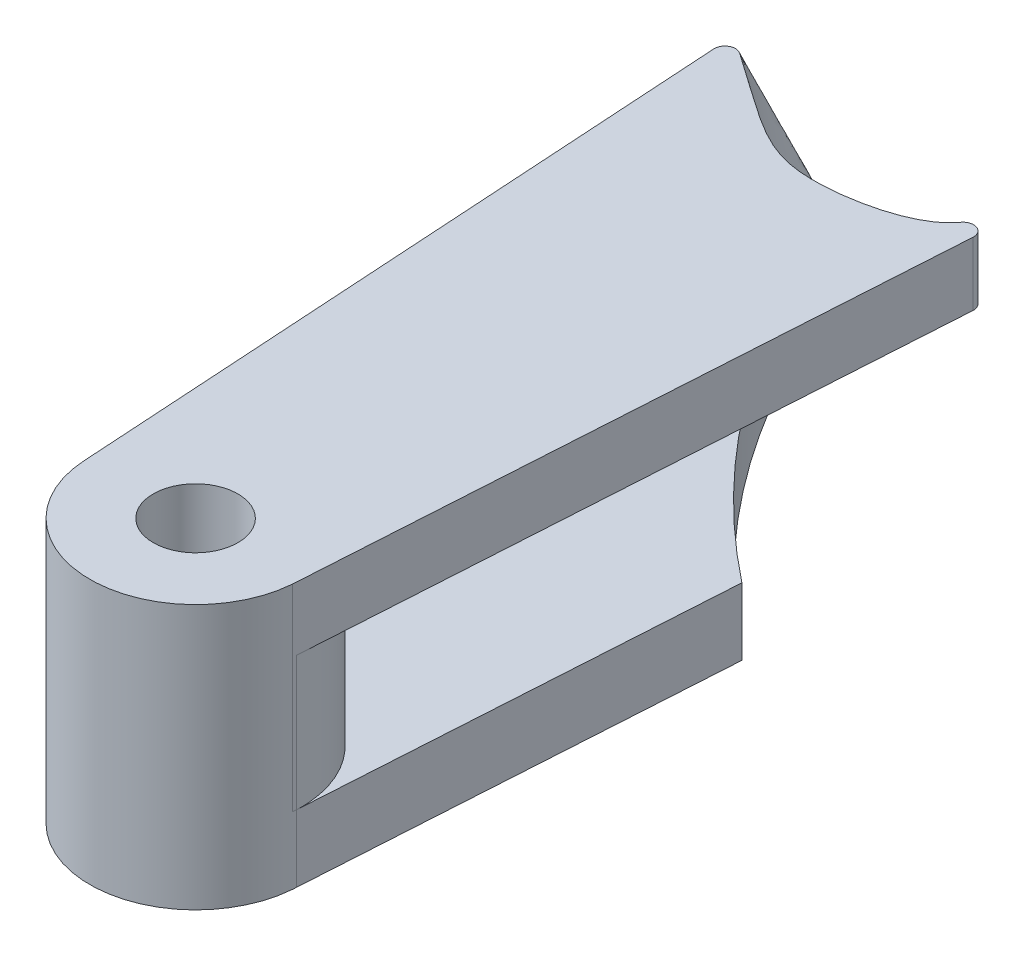
ISO-10303-21;
HEADER;
FILE_DESCRIPTION(('STEP AP214'),'2;1');
FILE_NAME('part.step','',(''),(''),'','','');
FILE_SCHEMA(('AUTOMOTIVE_DESIGN { 1 0 10303 214 1 1 1 1 }'));
ENDSEC;
DATA;
#1=APPLICATION_CONTEXT('core data for automotive mechanical design processes');
#2=APPLICATION_PROTOCOL_DEFINITION('international standard','automotive_design',2000,#1);
#3=PRODUCT_CONTEXT('',#1,'mechanical');
#4=PRODUCT('Part','Part','',(#3));
#5=PRODUCT_RELATED_PRODUCT_CATEGORY('part','',(#4));
#6=PRODUCT_DEFINITION_FORMATION('','',#4);
#7=PRODUCT_DEFINITION_CONTEXT('part definition',#1,'design');
#8=PRODUCT_DEFINITION('design','',#6,#7);
#9=PRODUCT_DEFINITION_SHAPE('','',#8);
#10=(LENGTH_UNIT() NAMED_UNIT(*) SI_UNIT(.MILLI.,.METRE.));
#11=(NAMED_UNIT(*) PLANE_ANGLE_UNIT() SI_UNIT($,.RADIAN.));
#12=(NAMED_UNIT(*) SI_UNIT($,.STERADIAN.) SOLID_ANGLE_UNIT());
#13=UNCERTAINTY_MEASURE_WITH_UNIT(LENGTH_MEASURE(1.E-05),#10,'distance_accuracy_value','');
#14=(GEOMETRIC_REPRESENTATION_CONTEXT(3) GLOBAL_UNCERTAINTY_ASSIGNED_CONTEXT((#13)) GLOBAL_UNIT_ASSIGNED_CONTEXT((#10,
#11,#12)) REPRESENTATION_CONTEXT('',''));
#15=CARTESIAN_POINT('',(0.,0.,0.));
#16=DIRECTION('',(0.,0.,1.));
#17=DIRECTION('',(1.,0.,0.));
#18=AXIS2_PLACEMENT_3D('',#15,#16,#17);
#19=CARTESIAN_POINT('',(0.,6.35,0.));
#20=DIRECTION('',(0.,1.,0.));
#21=DIRECTION('',(0.,0.,1.));
#22=AXIS2_PLACEMENT_3D('',#19,#20,#21);
#23=PLANE('',#22);
#24=CARTESIAN_POINT('',(77.1291578411723,6.35,-22.258706428602));
#25=DIRECTION('',(0.,1.,0.));
#26=DIRECTION('',(-0.886884795365881,0.,0.461990648984175));
#27=AXIS2_PLACEMENT_3D('',#24,#25,#26);
#28=CIRCLE('',#27,80.276752557407);
#29=CARTESIAN_POINT('',(5.93288873695193,6.35,14.8284222977497));
#30=VERTEX_POINT('',#29);
#31=CARTESIAN_POINT('',(27.458613200587,6.35,40.8062917579578));
#32=VERTEX_POINT('',#31);
#33=EDGE_CURVE('E440',#30,#32,#28,.T.);
#34=ORIENTED_EDGE('',*,*,#33,.F.);
#35=DIRECTION('',(0.0621376726951341,0.,0.998067587707382));
#36=VECTOR('',#35,1.);
#37=CARTESIAN_POINT('',(5.93285910815354,6.35,14.8282730639626));
#38=LINE('',#37,#36);
#39=CARTESIAN_POINT('',(9.47182264256985,6.35,71.6665235271673));
#40=VERTEX_POINT('',#39);
#41=EDGE_CURVE('E387',#30,#40,#38,.T.);
#42=ORIENTED_EDGE('',*,*,#41,.T.);
#43=CARTESIAN_POINT('',(5.01932412292618,6.35,80.6213767269513));
#44=CARTESIAN_POINT('',(4.95606493315617,6.35,79.6052951101865));
#45=CARTESIAN_POINT('',(5.09894269723994,6.35,78.5967664886193));
#46=CARTESIAN_POINT('',(5.24170512885611,6.35,77.5890519622007));
#47=CARTESIAN_POINT('',(5.58503786562933,6.35,76.6297643986857));
#48=CARTESIAN_POINT('',(5.92799993345408,6.35,75.6715125013754));
#49=CARTESIAN_POINT('',(6.45765354639501,6.35,74.8011234803486));
#50=CARTESIAN_POINT('',(6.98673533461972,6.35,73.9316741488525));
#51=CARTESIAN_POINT('',(7.68096549986152,6.35,73.1859164970054));
#52=CARTESIAN_POINT('',(8.37444616022552,6.35,72.4409639801492));
#53=CARTESIAN_POINT('',(9.20475205160239,6.35,71.8504539257334));
#54=CARTESIAN_POINT('',(10.0341615279488,6.35,71.2605813979135));
#55=CARTESIAN_POINT('',(10.9664558858977,6.35,70.8495616564237));
#56=CARTESIAN_POINT('',(11.8977437199464,6.35,70.4389856601843));
#57=CARTESIAN_POINT('',(12.8937522648495,6.35,70.2243301775186));
#58=CARTESIAN_POINT('',(13.8886854987512,6.35,70.0099064412603));
#59=CARTESIAN_POINT('',(14.9075182378542,6.35,70.0004276529608));
#60=CARTESIAN_POINT('',(15.9252510245346,6.35,69.9909590981528));
#61=CARTESIAN_POINT('',(16.925080943929,6.35,70.1870461450529));
#62=CARTESIAN_POINT('',(17.9238314267434,6.35,70.3829214924157));
#63=CARTESIAN_POINT('',(18.8636116515535,6.35,70.7765242448424));
#64=CARTESIAN_POINT('',(19.8023772706394,6.35,71.1697020557826));
#65=CARTESIAN_POINT('',(20.6435261975973,6.35,71.7446616025124));
#66=CARTESIAN_POINT('',(21.4837670032042,6.35,72.3190004113162));
#67=CARTESIAN_POINT('',(22.1917522242003,6.35,73.0517124450905));
#68=CARTESIAN_POINT('',(22.8989730900991,6.35,73.7836334282026));
#69=CARTESIAN_POINT('',(23.4447290809278,6.35,74.6440172937422));
#70=CARTESIAN_POINT('',(23.9898958625686,6.35,75.5034722714872));
#71=CARTESIAN_POINT('',(24.3510172346468,6.35,76.4562058923608));
#72=CARTESIAN_POINT('',(24.7117487327867,6.35,77.4079109227446));
#73=CARTESIAN_POINT('',(24.8734100607808,6.35,78.4138809087357));
#74=CARTESIAN_POINT('',(25.0349409536466,6.35,79.4190392360217));
#75=CARTESIAN_POINT('',(24.9904613187673,6.35,80.4366722320161));
#76=B_SPLINE_CURVE_WITH_KNOTS('',2,(#43,#44,#45,#46,#47,#48,#49,#50,#51,#52,#53,#54,#55,#56,#57,
#58,#59,#60,#61,#62,#63,#64,#65,#66,#67,#68,#69,#70,#71,#72,#73,#74,#75),.UNSPECIFIED.,.F.,.F.,
(3,2,2,2,2,2,2,2,2,2,2,2,2,2,2,2,3),(0.,0.0625,0.125,0.1875,0.25,0.3125,0.375,0.4375,0.5,0.5625,
0.625,0.6875,0.75,0.8125,0.875,0.9375,1.),.UNSPECIFIED.);
#77=CARTESIAN_POINT('',(24.9904613187673,6.35,80.4366722320161));
#78=VERTEX_POINT('',#77);
#79=EDGE_CURVE('E581',#40,#78,#76,.T.);
#80=ORIENTED_EDGE('',*,*,#79,.T.);
#81=DIRECTION('',(0.0621588566545776,0.,-0.998066268611156));
#82=VECTOR('',#81,1.);
#83=CARTESIAN_POINT('',(29.8840882961819,6.35,1.8611597436711));
#84=LINE('',#83,#82);
#85=EDGE_CURVE('E499',#78,#32,#84,.T.);
#86=ORIENTED_EDGE('',*,*,#85,.T.);
#87=EDGE_LOOP('',(#34,#42,#80,#86));
#88=FACE_BOUND('',#87,.T.);
#89=ADVANCED_FACE('F157',(#88),#23,.T.);
#90=CARTESIAN_POINT('',(15.,6.35,80.));
#91=DIRECTION('',(0.,-1.,0.));
#92=DIRECTION('',(0.,0.,-1.));
#93=AXIS2_PLACEMENT_3D('',#90,#91,#92);
#94=CYLINDRICAL_SURFACE('',#93,10.);
#95=DIRECTION('',(-8.55506561569698E-05,-0.999999994920126,-5.32994617574097E-05));
#96=VECTOR('',#95,1.);
#97=CARTESIAN_POINT('',(9.47220908049709,15.675,71.6656955325331));
#98=LINE('',#97,#96);
#99=CARTESIAN_POINT('',(9.47264559484052,19.,71.6661020201205));
#100=VERTEX_POINT('',#99);
#101=EDGE_CURVE('E397',#100,#40,#98,.T.);
#102=ORIENTED_EDGE('',*,*,#101,.F.);
#103=CARTESIAN_POINT('',(15.,19.,80.));
#104=DIRECTION('',(0.,1.,0.));
#105=DIRECTION('',(0.,0.,1.));
#106=AXIS2_PLACEMENT_3D('',#103,#104,#105);
#107=CIRCLE('',#106,10.);
#108=CARTESIAN_POINT('',(24.9904613187674,19.,80.4366722320162));
#109=VERTEX_POINT('',#108);
#110=EDGE_CURVE('E604',#109,#100,#107,.T.);
#111=ORIENTED_EDGE('',*,*,#110,.F.);
#112=DIRECTION('',(0.,-1.,0.));
#113=VECTOR('',#112,1.);
#114=CARTESIAN_POINT('',(24.9904613187673,25.,80.4366722320161));
#115=LINE('',#114,#113);
#116=EDGE_CURVE('E525',#109,#78,#115,.T.);
#117=ORIENTED_EDGE('',*,*,#116,.T.);
#118=ORIENTED_EDGE('',*,*,#79,.F.);
#119=EDGE_LOOP('',(#102,#111,#117,#118));
#120=FACE_BOUND('',#119,.T.);
#121=ADVANCED_FACE('F458',(#120),#94,.T.);
#122=CARTESIAN_POINT('',(1.46370607642486,6.35,7.41703982173946));
#123=DIRECTION('',(0.,-1.,0.));
#124=DIRECTION('',(0.,0.,-1.));
#125=AXIS2_PLACEMENT_3D('',#122,#123,#124);
#126=CYLINDRICAL_SURFACE('',#125,0.999999999999996);
#127=CARTESIAN_POINT('',(1.46370607642486,0.,7.41703982173946));
#128=DIRECTION('',(0.,1.,0.));
#129=DIRECTION('',(0.,0.,1.));
#130=AXIS2_PLACEMENT_3D('',#127,#128,#129);
#131=CIRCLE('',#130,0.999999999999996);
#132=CARTESIAN_POINT('',(2.39466664490112,0.,7.05192008803228));
#133=VERTEX_POINT('',#132);
#134=CARTESIAN_POINT('',(0.465638488717503,0.,7.47917749443459));
#135=VERTEX_POINT('',#134);
#136=EDGE_CURVE('E554',#133,#135,#131,.T.);
#137=ORIENTED_EDGE('',*,*,#136,.T.);
#138=DIRECTION('',(0.,-1.,0.));
#139=VECTOR('',#138,1.);
#140=CARTESIAN_POINT('',(0.465638488717503,6.35,7.47917749443459));
#141=LINE('',#140,#139);
#142=CARTESIAN_POINT('',(0.465638488717484,6.35,7.47917749443459));
#143=VERTEX_POINT('',#142);
#144=EDGE_CURVE('E562',#143,#135,#141,.T.);
#145=ORIENTED_EDGE('',*,*,#144,.F.);
#146=CARTESIAN_POINT('',(6.32282027819019,6.35,15.5768859824607));
#147=CARTESIAN_POINT('',(6.1928332215113,6.35,15.3273483429614));
#148=CARTESIAN_POINT('',(6.06284616483242,6.35,15.077810703462));
#149=CARTESIAN_POINT('',(5.93285910815354,6.35,14.8282730639626));
#150=CARTESIAN_POINT('',(5.66622124978688,6.35,14.3164053174504));
#151=CARTESIAN_POINT('',(5.09782729504705,6.35,13.1987429795062));
#152=CARTESIAN_POINT('',(4.14876074309505,6.35,11.208464918304));
#153=CARTESIAN_POINT('',(3.19307527576975,6.34999999999999,9.04033962207436));
#154=CARTESIAN_POINT('',(2.64212838932416,6.35,7.682883317341));
#155=CARTESIAN_POINT('',(2.29594948225461,6.35,6.80021694144356));
#156=CARTESIAN_POINT('',(1.90873145031141,6.35,6.41966737271436));
#157=CARTESIAN_POINT('',(1.16171554831994,6.35,6.37836467537544));
#158=CARTESIAN_POINT('',(0.580191045726904,6.35,6.79857765774915));
#159=CARTESIAN_POINT('',(0.451619128433707,6.35,7.25399575696786));
#160=CARTESIAN_POINT('',(0.844789386168708,6.35,13.5691741934234));
#161=CARTESIAN_POINT('',(1.59835438912464,6.35,25.6730843023682));
#162=CARTESIAN_POINT('',(2.72452070321727,6.35,43.7617903596157));
#163=CARTESIAN_POINT('',(3.85614208714559,6.35,61.9381168274057));
#164=CARTESIAN_POINT('',(4.62091815244912,6.35,74.2221012369732));
#165=CARTESIAN_POINT('',(5.0078314115034,6.35,80.4367785231817));
#166=B_SPLINE_CURVE_WITH_KNOTS('',3,(#146,#147,#148,#149,#150,#151,#152,#153,#154,#155,#156,
#157,#158,#159,#160,#161,#162,#163,#164,#165),.UNSPECIFIED.,.F.,.F.,(4,3,1,1,1,2,1,1,1,2,1,1,1,
4),(0.,0.01,0.0305126468110863,0.0510252936221727,0.0715379404332591,0.0920505872443453,
0.100233469445633,0.10841635164692,0.116599233848207,0.124782116049495,0.346086587037121,
0.567391058024747,0.788695529012374,1.01),.UNSPECIFIED.);
#167=CARTESIAN_POINT('',(2.3946666449011,6.35,7.05192008803229));
#168=VERTEX_POINT('',#167);
#169=EDGE_CURVE('E646',#168,#143,#166,.T.);
#170=ORIENTED_EDGE('',*,*,#169,.F.);
#171=DIRECTION('',(0.,-1.,0.));
#172=VECTOR('',#171,1.);
#173=CARTESIAN_POINT('',(2.39466664490112,6.35,7.05192008803228));
#174=LINE('',#173,#172);
#175=EDGE_CURVE('E569',#168,#133,#174,.T.);
#176=ORIENTED_EDGE('',*,*,#175,.T.);
#177=EDGE_LOOP('',(#137,#145,#170,#176));
#178=FACE_BOUND('',#177,.T.);
#179=ADVANCED_FACE('F416',(#178),#126,.T.);
#180=CARTESIAN_POINT('',(0.,6.35,0.));
#181=DIRECTION('',(0.998067587707382,0.,-0.062137672695134));
#182=DIRECTION('',(-0.062137672695134,0.,-0.998067587707382));
#183=AXIS2_PLACEMENT_3D('',#180,#181,#182);
#184=PLANE('',#183);
#185=DIRECTION('',(0.062137672695134,0.,0.998067587707382));
#186=VECTOR('',#185,1.);
#187=CARTESIAN_POINT('',(0.,0.,0.));
#188=LINE('',#187,#186);
#189=CARTESIAN_POINT('',(5.01932412292618,0.,80.6213767269513));
#190=VERTEX_POINT('',#189);
#191=EDGE_CURVE('E478',#135,#190,#188,.T.);
#192=ORIENTED_EDGE('',*,*,#191,.T.);
#193=DIRECTION('',(0.,-1.,0.));
#194=VECTOR('',#193,1.);
#195=CARTESIAN_POINT('',(5.01932412292618,6.35,80.6213767269513));
#196=LINE('',#195,#194);
#197=CARTESIAN_POINT('',(5.01932412292618,6.35,80.6213767269513));
#198=VERTEX_POINT('',#197);
#199=EDGE_CURVE('E495',#198,#190,#196,.T.);
#200=ORIENTED_EDGE('',*,*,#199,.F.);
#201=CARTESIAN_POINT('',(15.,6.35,80.));
#202=DIRECTION('',(0.,1.,0.));
#203=DIRECTION('',(-0.99904599373284,0.,0.0436703836296736));
#204=AXIS2_PLACEMENT_3D('',#201,#202,#203);
#205=CIRCLE('',#204,10.);
#206=CARTESIAN_POINT('',(5.00868231832043,6.35,80.4367413291806));
#207=VERTEX_POINT('',#206);
#208=EDGE_CURVE('E568',#207,#198,#205,.T.);
#209=ORIENTED_EDGE('',*,*,#208,.F.);
#210=DIRECTION('',(-0.062137672695134,0.,-0.998067587707382));
#211=VECTOR('',#210,1.);
#212=CARTESIAN_POINT('',(0.,6.35,0.));
#213=LINE('',#212,#211);
#214=EDGE_CURVE('E501',#143,#207,#213,.F.);
#215=ORIENTED_EDGE('',*,*,#214,.F.);
#216=ORIENTED_EDGE('',*,*,#144,.T.);
#217=EDGE_LOOP('',(#192,#200,#209,#215,#216));
#218=FACE_BOUND('',#217,.T.);
#219=ADVANCED_FACE('F559',(#218),#184,.F.);
#220=CARTESIAN_POINT('',(29.8840882961819,6.35,1.8611597436711));
#221=DIRECTION('',(-0.998066268611156,0.,-0.0621588566545776));
#222=DIRECTION('',(-0.0621588566545776,0.,0.998066268611156));
#223=AXIS2_PLACEMENT_3D('',#220,#221,#222);
#224=PLANE('',#223);
#225=DIRECTION('',(0.0621588566545776,0.,-0.998066268611156));
#226=VECTOR('',#225,1.);
#227=CARTESIAN_POINT('',(29.8840882961819,0.,1.8611597436711));
#228=LINE('',#227,#226);
#229=CARTESIAN_POINT('',(24.9904613187673,0.,80.4366722320161));
#230=VERTEX_POINT('',#229);
#231=CARTESIAN_POINT('',(27.458613200587,0.,40.8062917579578));
#232=VERTEX_POINT('',#231);
#233=EDGE_CURVE('E470',#230,#232,#228,.T.);
#234=ORIENTED_EDGE('',*,*,#233,.T.);
#235=DIRECTION('',(0.,-1.,0.));
#236=VECTOR('',#235,1.);
#237=CARTESIAN_POINT('',(27.458613200587,6.35,40.8062917579578));
#238=LINE('',#237,#236);
#239=EDGE_CURVE('E496',#32,#232,#238,.T.);
#240=ORIENTED_EDGE('',*,*,#239,.F.);
#241=ORIENTED_EDGE('',*,*,#85,.F.);
#242=DIRECTION('',(0.,-1.,0.));
#243=VECTOR('',#242,1.);
#244=CARTESIAN_POINT('',(24.9904613187673,6.35,80.4366722320161));
#245=LINE('',#244,#243);
#246=EDGE_CURVE('E492',#78,#230,#245,.T.);
#247=ORIENTED_EDGE('',*,*,#246,.T.);
#248=EDGE_LOOP('',(#234,#240,#241,#247));
#249=FACE_BOUND('',#248,.T.);
#250=ADVANCED_FACE('F414',(#249),#224,.F.);
#251=CARTESIAN_POINT('',(77.1291578411723,6.35,-22.258706428602));
#252=DIRECTION('',(0.,-1.,0.));
#253=DIRECTION('',(0.,0.,-1.));
#254=AXIS2_PLACEMENT_3D('',#251,#252,#253);
#255=CYLINDRICAL_SURFACE('',#254,80.276752557407);
#256=CARTESIAN_POINT('',(77.1291578411723,0.,-22.258706428602));
#257=DIRECTION('',(0.,1.,0.));
#258=DIRECTION('',(0.,0.,1.));
#259=AXIS2_PLACEMENT_3D('',#256,#257,#258);
#260=CIRCLE('',#259,80.276752557407);
#261=EDGE_CURVE('E485',#133,#232,#260,.T.);
#262=ORIENTED_EDGE('',*,*,#261,.F.);
#263=ORIENTED_EDGE('',*,*,#175,.F.);
#264=CARTESIAN_POINT('',(2.39466664490109,6.35,7.0519200880323));
#265=CARTESIAN_POINT('',(2.44464859981067,6.35000728270613,7.17936111124257));
#266=CARTESIAN_POINT('',(2.49495654016193,6.3500134010576,7.30667428729009));
#267=CARTESIAN_POINT('',(2.59622252687148,6.35000205183596,7.56104027510252));
#268=CARTESIAN_POINT('',(2.64718056639409,6.34998458451065,7.68809308958882));
#269=CARTESIAN_POINT('',(2.74973213749686,6.34990481849986,7.94190220967224));
#270=CARTESIAN_POINT('',(2.80132549438636,6.34984253187907,8.06865858585584));
#271=CARTESIAN_POINT('',(2.90516000698031,6.34970491476079,8.32190631465699));
#272=CARTESIAN_POINT('',(2.9574011653398,6.34962958420982,8.44839766618586));
#273=CARTESIAN_POINT('',(3.06518657005679,6.34951774220111,8.70749822956396));
#274=CARTESIAN_POINT('',(3.12076430686761,6.34948338527521,8.840093513744));
#275=CARTESIAN_POINT('',(3.23263145122068,6.34962021166099,9.10498370791426));
#276=CARTESIAN_POINT('',(3.28892086010065,6.34979139535908,9.23727861733933));
#277=CARTESIAN_POINT('',(3.40220994998984,6.35016856198565,9.50156476569438));
#278=CARTESIAN_POINT('',(3.45920963496752,6.35037454510865,9.6335560029228));
#279=CARTESIAN_POINT('',(3.57391735295031,6.35064972798389,9.89723032254398));
#280=CARTESIAN_POINT('',(3.63162538513441,6.35071892789465,10.0289134052937));
#281=CARTESIAN_POINT('',(3.74775056330463,6.35067876875804,10.291973123717));
#282=CARTESIAN_POINT('',(3.8061677390192,6.35056940219904,10.4233497462661));
#283=CARTESIAN_POINT('',(3.92370710161978,6.35021570379876,10.6857871241471));
#284=CARTESIAN_POINT('',(3.98282928902789,6.34997137185752,10.816847879245));
#285=CARTESIAN_POINT('',(4.10177699480175,6.34957998322847,11.0786497955487));
#286=CARTESIAN_POINT('',(4.16160251207382,6.34943292638941,11.2093909572509));
#287=CARTESIAN_POINT('',(4.28195516605033,6.34937434301562,11.4705499490919));
#288=CARTESIAN_POINT('',(4.34248230265895,6.34946281644871,11.6009677792748));
#289=CARTESIAN_POINT('',(4.46430612186859,6.34968862904146,11.8616254171256));
#290=CARTESIAN_POINT('',(4.52560360604251,6.34982602402058,11.9918648501312));
#291=CARTESIAN_POINT('',(4.64889818910727,6.35007056700959,12.2520119300651));
#292=CARTESIAN_POINT('',(4.710895287939,6.35017771502204,12.3819195770214));
#293=CARTESIAN_POINT('',(4.89793367466714,6.35033867137539,12.7711398960173));
#294=CARTESIAN_POINT('',(5.02402239305938,6.35023199352642,13.0299506742197));
#295=CARTESIAN_POINT('',(5.21523454823948,6.35001510396126,13.4171307182995));
#296=CARTESIAN_POINT('',(5.27931713796012,6.34993333085493,13.5460154669614));
#297=CARTESIAN_POINT('',(5.40817476419508,6.34981963363935,13.8034386155478));
#298=CARTESIAN_POINT('',(5.47294980063619,6.34978770952484,13.9319770155089));
#299=CARTESIAN_POINT('',(5.60319027804821,6.34979656059265,14.1887033983474));
#300=CARTESIAN_POINT('',(5.66865571861319,6.34983733573223,14.3168913814308));
#301=CARTESIAN_POINT('',(5.8002751821991,6.34992786394958,14.5729133790092));
#302=CARTESIAN_POINT('',(5.86642920534852,6.34997761702901,14.7007473934382));
#303=CARTESIAN_POINT('',(5.93292657780038,6.34999999841502,14.8284025859279));
#304=B_SPLINE_CURVE_WITH_KNOTS('',3,(#264,#265,#266,#267,#268,#269,#270,#271,#272,#273,#274,
#275,#276,#277,#278,#279,#280,#281,#282,#283,#284,#285,#286,#287,#288,#289,#290,#291,#292,#293,
#294,#295,#296,#297,#298,#299,#300,#301,#302,#303),.UNSPECIFIED.,.F.,.F.,(4,2,2,2,2,2,2,2,2,2,2,
2,2,2,2,2,2,2,2,4),(0.,0.41067545400918,0.821346593387466,1.23190722758724,1.64246954503758,
2.0737834387401,2.50509814329731,2.93641525878479,3.36773187440589,3.79906663439757,
4.23040171383278,4.6617361226259,5.09307047251446,5.52489856030974,5.95672661161469,
6.82038030346385,7.25218980003621,7.68399925095776,8.11580844801068,8.54761772563734),.UNSPECIFIED.);
#305=EDGE_CURVE('E407',#168,#30,#304,.T.);
#306=ORIENTED_EDGE('',*,*,#305,.T.);
#307=ORIENTED_EDGE('',*,*,#33,.T.);
#308=ORIENTED_EDGE('',*,*,#239,.T.);
#309=EDGE_LOOP('',(#262,#263,#306,#307,#308));
#310=FACE_BOUND('',#309,.T.);
#311=ADVANCED_FACE('F409',(#310),#255,.F.);
#312=CARTESIAN_POINT('',(0.,0.,0.));
#313=DIRECTION('',(0.,1.,0.));
#314=DIRECTION('',(0.,0.,1.));
#315=AXIS2_PLACEMENT_3D('',#312,#313,#314);
#316=PLANE('',#315);
#317=ORIENTED_EDGE('',*,*,#233,.F.);
#318=CARTESIAN_POINT('',(15.,0.,80.));
#319=DIRECTION('',(0.,1.,0.));
#320=DIRECTION('',(0.996744167783532,0.,0.0806291757958265));
#321=AXIS2_PLACEMENT_3D('',#318,#319,#320);
#322=CIRCLE('',#321,10.);
#323=CARTESIAN_POINT('',(24.9674416778353,0.,80.8062917579583));
#324=VERTEX_POINT('',#323);
#325=EDGE_CURVE('E168',#324,#230,#322,.T.);
#326=ORIENTED_EDGE('',*,*,#325,.F.);
#327=CARTESIAN_POINT('',(15.,0.,80.));
#328=DIRECTION('',(0.,1.,0.));
#329=DIRECTION('',(0.,0.,1.));
#330=AXIS2_PLACEMENT_3D('',#327,#328,#329);
#331=CIRCLE('',#330,10.);
#332=EDGE_CURVE('E481',#190,#324,#331,.T.);
#333=ORIENTED_EDGE('',*,*,#332,.F.);
#334=ORIENTED_EDGE('',*,*,#191,.F.);
#335=ORIENTED_EDGE('',*,*,#136,.F.);
#336=ORIENTED_EDGE('',*,*,#261,.T.);
#337=EDGE_LOOP('',(#317,#326,#333,#334,#335,#336));
#338=FACE_BOUND('',#337,.T.);
#339=CARTESIAN_POINT('',(15.,0.,80.));
#340=DIRECTION('',(0.,1.,0.));
#341=DIRECTION('',(0.,0.,1.));
#342=AXIS2_PLACEMENT_3D('',#339,#340,#341);
#343=CIRCLE('',#342,4.00000000000002);
#344=CARTESIAN_POINT('',(15.,0.,84.));
#345=VERTEX_POINT('',#344);
#346=EDGE_CURVE('E486',#345,#345,#343,.T.);
#347=ORIENTED_EDGE('',*,*,#346,.T.);
#348=EDGE_LOOP('',(#347));
#349=FACE_BOUND('',#348,.T.);
#350=ADVANCED_FACE('F413',(#338,#349),#316,.F.);
#351=CARTESIAN_POINT('',(15.,6.35,80.));
#352=DIRECTION('',(0.,-1.,0.));
#353=DIRECTION('',(0.,0.,-1.));
#354=AXIS2_PLACEMENT_3D('',#351,#352,#353);
#355=CYLINDRICAL_SURFACE('',#354,4.00000000000002);
#356=CARTESIAN_POINT('',(15.,25.,80.));
#357=DIRECTION('',(0.,1.,0.));
#358=DIRECTION('',(0.,0.,1.));
#359=AXIS2_PLACEMENT_3D('',#356,#357,#358);
#360=CIRCLE('',#359,4.00000000000002);
#361=CARTESIAN_POINT('',(15.,25.,84.));
#362=VERTEX_POINT('',#361);
#363=EDGE_CURVE('E627',#362,#362,#360,.T.);
#364=ORIENTED_EDGE('',*,*,#363,.T.);
#365=EDGE_LOOP('',(#364));
#366=FACE_BOUND('',#365,.T.);
#367=ORIENTED_EDGE('',*,*,#346,.F.);
#368=EDGE_LOOP('',(#367));
#369=FACE_BOUND('',#368,.T.);
#370=ADVANCED_FACE('F419',(#366,#369),#355,.F.);
#371=CARTESIAN_POINT('',(5.0078362054718,19.,80.4368555248503));
#372=DIRECTION('',(0.062137672695133,0.,0.998067587707382));
#373=VECTOR('',#372,1.);
#374=LINE('',#371,#373);
#375=CARTESIAN_POINT('',(5.00868935050497,19.,80.4368075071028));
#376=VERTEX_POINT('',#375);
#377=CARTESIAN_POINT('',(5.01932412292617,19.,80.6213767269513));
#378=VERTEX_POINT('',#377);
#379=EDGE_CURVE('E591',#376,#378,#374,.T.);
#380=ORIENTED_EDGE('',*,*,#379,.F.);
#381=DIRECTION('',(-9.18090135335133E-05,-0.999999995785475,-3.9483850487889E-07));
#382=VECTOR('',#381,1.);
#383=CARTESIAN_POINT('',(5.0086875305582,15.675,80.4367822050507));
#384=LINE('',#383,#382);
#385=EDGE_CURVE('E392',#376,#207,#384,.T.);
#386=ORIENTED_EDGE('',*,*,#385,.T.);
#387=ORIENTED_EDGE('',*,*,#208,.T.);
#388=ORIENTED_EDGE('',*,*,#199,.T.);
#389=ORIENTED_EDGE('',*,*,#332,.T.);
#390=ORIENTED_EDGE('',*,*,#325,.T.);
#391=ORIENTED_EDGE('',*,*,#246,.F.);
#392=CARTESIAN_POINT('',(15.,6.35,80.));
#393=DIRECTION('',(0.,-1.,0.));
#394=DIRECTION('',(0.999046131876732,0.,0.0436672232016127));
#395=AXIS2_PLACEMENT_3D('',#392,#393,#394);
#396=CIRCLE('',#395,10.);
#397=CARTESIAN_POINT('',(24.9674416778354,6.35,80.8062917579577));
#398=VERTEX_POINT('',#397);
#399=EDGE_CURVE('E509',#78,#398,#396,.T.);
#400=ORIENTED_EDGE('',*,*,#399,.T.);
#401=DIRECTION('',(0.,-1.,0.));
#402=VECTOR('',#401,1.);
#403=CARTESIAN_POINT('',(24.9674416778354,25.,80.8062917579577));
#404=LINE('',#403,#402);
#405=CARTESIAN_POINT('',(24.9674416778354,25.,80.8062917579577));
#406=VERTEX_POINT('',#405);
#407=EDGE_CURVE('E519',#406,#398,#404,.T.);
#408=ORIENTED_EDGE('',*,*,#407,.F.);
#409=CARTESIAN_POINT('',(15.,25.,80.));
#410=DIRECTION('',(0.,1.,0.));
#411=DIRECTION('',(0.,0.,1.));
#412=AXIS2_PLACEMENT_3D('',#409,#410,#411);
#413=CIRCLE('',#412,10.);
#414=CARTESIAN_POINT('',(5.01932412292617,25.,80.6213767269513));
#415=VERTEX_POINT('',#414);
#416=EDGE_CURVE('E531',#415,#406,#413,.T.);
#417=ORIENTED_EDGE('',*,*,#416,.F.);
#418=DIRECTION('',(0.,1.,0.));
#419=VECTOR('',#418,1.);
#420=CARTESIAN_POINT('',(5.01932412292617,19.,80.6213767269513));
#421=LINE('',#420,#419);
#422=EDGE_CURVE('E277',#378,#415,#421,.T.);
#423=ORIENTED_EDGE('',*,*,#422,.F.);
#424=EDGE_LOOP('',(#380,#386,#387,#388,#389,#390,#391,#400,#408,#417,#423));
#425=FACE_BOUND('',#424,.T.);
#426=ADVANCED_FACE('F159',(#425),#94,.T.);
#427=CARTESIAN_POINT('',(29.8840882961819,25.,1.8611597436711));
#428=DIRECTION('',(-0.998066268611156,0.,-0.0621588566545776));
#429=DIRECTION('',(-0.0621588566545776,0.,0.998066268611156));
#430=AXIS2_PLACEMENT_3D('',#427,#428,#429);
#431=PLANE('',#430);
#432=ORIENTED_EDGE('',*,*,#407,.T.);
#433=ORIENTED_EDGE('',*,*,#399,.F.);
#434=ORIENTED_EDGE('',*,*,#116,.F.);
#435=DIRECTION('',(-0.0621588566545774,0.,0.998066268611156));
#436=VECTOR('',#435,1.);
#437=CARTESIAN_POINT('',(29.8840882961819,19.,1.86115974367109));
#438=LINE('',#437,#436);
#439=CARTESIAN_POINT('',(28.7393809124881,19.,20.2413856452474));
#440=VERTEX_POINT('',#439);
#441=EDGE_CURVE('E596',#440,#109,#438,.T.);
#442=ORIENTED_EDGE('',*,*,#441,.F.);
#443=DIRECTION('',(0.,1.,0.));
#444=VECTOR('',#443,1.);
#445=CARTESIAN_POINT('',(28.7393809124881,19.,20.2413856452474));
#446=LINE('',#445,#444);
#447=CARTESIAN_POINT('',(28.7393809124881,25.,20.2413856452474));
#448=VERTEX_POINT('',#447);
#449=EDGE_CURVE('E632',#440,#448,#446,.T.);
#450=ORIENTED_EDGE('',*,*,#449,.T.);
#451=DIRECTION('',(0.0621588566545776,0.,-0.998066268611156));
#452=VECTOR('',#451,1.);
#453=CARTESIAN_POINT('',(29.8840882961819,25.,1.8611597436711));
#454=LINE('',#453,#452);
#455=EDGE_CURVE('E629',#406,#448,#454,.T.);
#456=ORIENTED_EDGE('',*,*,#455,.F.);
#457=EDGE_LOOP('',(#432,#433,#434,#442,#450,#456));
#458=FACE_BOUND('',#457,.T.);
#459=ADVANCED_FACE('F315',(#458),#431,.F.);
#460=CARTESIAN_POINT('',(0.,25.,0.));
#461=DIRECTION('',(0.,1.,0.));
#462=DIRECTION('',(0.,0.,1.));
#463=AXIS2_PLACEMENT_3D('',#460,#461,#462);
#464=PLANE('',#463);
#465=DIRECTION('',(0.062137672695134,0.,0.998067587707382));
#466=VECTOR('',#465,1.);
#467=CARTESIAN_POINT('',(1.06328286829713,25.,17.0786597145118));
#468=LINE('',#467,#466);
#469=CARTESIAN_POINT('',(1.06328286829713,25.,17.0786597145118));
#470=VERTEX_POINT('',#469);
#471=CARTESIAN_POINT('',(5.00783847929081,25.,80.436892047381));
#472=VERTEX_POINT('',#471);
#473=EDGE_CURVE('E282',#470,#472,#468,.T.);
#474=ORIENTED_EDGE('',*,*,#473,.T.);
#475=DIRECTION('',(0.062137672695134,0.,0.998067587707382));
#476=VECTOR('',#475,1.);
#477=CARTESIAN_POINT('',(1.06328286829713,25.,17.0786597145118));
#478=LINE('',#477,#476);
#479=EDGE_CURVE('E286',#472,#415,#478,.T.);
#480=ORIENTED_EDGE('',*,*,#479,.T.);
#481=ORIENTED_EDGE('',*,*,#416,.T.);
#482=ORIENTED_EDGE('',*,*,#455,.T.);
#483=CARTESIAN_POINT('',(27.741314643877,25.,20.1792267885928));
#484=DIRECTION('',(0.,1.,0.));
#485=DIRECTION('',(0.,0.,1.));
#486=AXIS2_PLACEMENT_3D('',#483,#484,#485);
#487=CIRCLE('',#486,1.);
#488=CARTESIAN_POINT('',(26.9274067801342,25.,19.5982328218964));
#489=VERTEX_POINT('',#488);
#490=EDGE_CURVE('E288',#448,#489,#487,.T.);
#491=ORIENTED_EDGE('',*,*,#490,.T.);
#492=CARTESIAN_POINT('',(6.17261589682704,25.,18.6719496317245));
#493=CARTESIAN_POINT('',(10.7247623243548,25.,21.8755990988121));
#494=CARTESIAN_POINT('',(14.5415503893702,25.,24.3433115144424));
#495=CARTESIAN_POINT('',(25.2545618570401,25.,21.9417023168898));
#496=CARTESIAN_POINT('',(26.9274067801342,25.,19.5982328218964));
#497=B_SPLINE_CURVE_WITH_KNOTS('',3,(#492,#493,#494,#495,#496),.UNSPECIFIED.,.F.,.F.,(4,1,4),
(0.126813972235005,0.520426396952037,0.834950497041541),.UNSPECIFIED.);
#498=CARTESIAN_POINT('',(6.1725674442645,25.,18.6720185803975));
#499=VERTEX_POINT('',#498);
#500=EDGE_CURVE('E339',#499,#489,#497,.T.);
#501=ORIENTED_EDGE('',*,*,#500,.F.);
#502=CARTESIAN_POINT('',(5.00954364961302,25.,80.4367858869198));
#503=CARTESIAN_POINT('',(4.68807688487182,25.,75.275562904105));
#504=CARTESIAN_POINT('',(4.03777895199665,25.,64.8348797450405));
#505=CARTESIAN_POINT('',(3.04789157014873,25.,48.9420097318526));
#506=CARTESIAN_POINT('',(2.05251547110421,25.,32.9610170993198));
#507=CARTESIAN_POINT('',(1.39157938354635,25.,22.3495359154976));
#508=CARTESIAN_POINT('',(1.05114912832766,25.,16.8837651834498));
#509=CARTESIAN_POINT('',(1.14623808947865,25.,16.4741026459069));
#510=CARTESIAN_POINT('',(1.61310266116214,25.,16.0580338401342));
#511=CARTESIAN_POINT('',(2.1835173028814,25.,15.9767263000998));
#512=CARTESIAN_POINT('',(2.49956457913811,25.,16.1042295654679));
#513=CARTESIAN_POINT('',(2.9500579414992,25.,16.4140637396052));
#514=CARTESIAN_POINT('',(3.52492670013303,25.,16.8121175458939));
#515=CARTESIAN_POINT('',(4.32925211315049,25.,17.3740261052926));
#516=CARTESIAN_POINT('',(5.16147826817217,25.,17.9591370711886));
#517=CARTESIAN_POINT('',(5.78058198130546,25.,18.3960490979379));
#518=CARTESIAN_POINT('',(6.17256070041508,25.,18.6719107863171));
#519=CARTESIAN_POINT('',(6.36365194413393,25.,18.8063944982045));
#520=CARTESIAN_POINT('',(6.55474318785279,25.,18.940878210092));
#521=CARTESIAN_POINT('',(6.74583443157165,25.,19.0753619219795));
#522=B_SPLINE_CURVE_WITH_KNOTS('',3,(#502,#503,#504,#505,#506,#507,#508,#509,#510,#511,#512,
#513,#514,#515,#516,#517,#518,#519,#520,#521),.UNSPECIFIED.,.F.,.F.,(4,1,1,1,2,1,1,1,2,1,1,1,3,
4),(0.,0.221304470987626,0.442608941975253,0.663913412962879,0.885217883950505,
0.893400766151793,0.90158364835308,0.909766530554367,0.917949412755655,0.938462059566741,
0.958974706377827,0.979487353188914,1.,1.01),.UNSPECIFIED.);
#523=CARTESIAN_POINT('',(2.62802828857072,25.,16.1925825816146));
#524=VERTEX_POINT('',#523);
#525=EDGE_CURVE('E294',#524,#499,#522,.T.);
#526=ORIENTED_EDGE('',*,*,#525,.F.);
#527=CARTESIAN_POINT('',(5.00954364961302,25.,80.4367858869198));
#528=CARTESIAN_POINT('',(4.68807688487182,25.,75.275562904105));
#529=CARTESIAN_POINT('',(4.03777895199665,25.,64.8348797450405));
#530=CARTESIAN_POINT('',(3.04789157014873,25.,48.9420097318526));
#531=CARTESIAN_POINT('',(2.05251547110421,25.,32.9610170993198));
#532=CARTESIAN_POINT('',(1.39157938354635,25.,22.3495359154976));
#533=CARTESIAN_POINT('',(1.05114912832766,25.,16.8837651834498));
#534=CARTESIAN_POINT('',(1.14623808947865,25.,16.4741026459069));
#535=CARTESIAN_POINT('',(1.61310266116214,25.,16.0580338401342));
#536=CARTESIAN_POINT('',(2.1835173028814,25.,15.9767263000998));
#537=CARTESIAN_POINT('',(2.49956457913811,25.,16.1042295654679));
#538=CARTESIAN_POINT('',(2.9500579414992,25.,16.4140637396052));
#539=CARTESIAN_POINT('',(3.52492670013303,25.,16.8121175458939));
#540=CARTESIAN_POINT('',(4.32925211315049,25.,17.3740261052926));
#541=CARTESIAN_POINT('',(5.16147826817217,25.,17.9591370711886));
#542=CARTESIAN_POINT('',(5.78058198130546,25.,18.3960490979379));
#543=CARTESIAN_POINT('',(6.17256070041508,25.,18.6719107863171));
#544=CARTESIAN_POINT('',(6.36365194413393,25.,18.8063944982045));
#545=CARTESIAN_POINT('',(6.55474318785279,25.,18.940878210092));
#546=CARTESIAN_POINT('',(6.74583443157165,25.,19.0753619219795));
#547=B_SPLINE_CURVE_WITH_KNOTS('',3,(#527,#528,#529,#530,#531,#532,#533,#534,#535,#536,#537,
#538,#539,#540,#541,#542,#543,#544,#545,#546),.UNSPECIFIED.,.F.,.F.,(4,1,1,1,2,1,1,1,2,1,1,1,3,
4),(0.,0.221304470987626,0.442608941975253,0.663913412962879,0.885217883950505,
0.893400766151793,0.90158364835308,0.909766530554367,0.917949412755655,0.938462059566741,
0.958974706377827,0.979487353188914,1.,1.01),.UNSPECIFIED.);
#548=EDGE_CURVE('E269',#524,#470,#547,.F.);
#549=ORIENTED_EDGE('',*,*,#548,.T.);
#550=EDGE_LOOP('',(#474,#480,#481,#482,#491,#501,#526,#549));
#551=FACE_BOUND('',#550,.T.);
#552=ORIENTED_EDGE('',*,*,#363,.F.);
#553=EDGE_LOOP('',(#552));
#554=FACE_BOUND('',#553,.T.);
#555=ADVANCED_FACE('F291',(#551,#554),#464,.T.);
#556=CARTESIAN_POINT('',(0.,19.,0.));
#557=DIRECTION('',(0.,1.,0.));
#558=DIRECTION('',(0.,0.,1.));
#559=AXIS2_PLACEMENT_3D('',#556,#557,#558);
#560=PLANE('',#559);
#561=ORIENTED_EDGE('',*,*,#110,.T.);
#562=CARTESIAN_POINT('',(9.47249353643026,19.,71.6658727532443));
#563=CARTESIAN_POINT('',(9.07796556828615,19.,65.3303236940317));
#564=CARTESIAN_POINT('',(8.68343760014204,19.,58.9947746348191));
#565=CARTESIAN_POINT('',(7.92333217777387,19.,46.7885799352636));
#566=CARTESIAN_POINT('',(7.55775472354982,19.,40.9179342949207));
#567=CARTESIAN_POINT('',(6.82659981510171,19.,29.1766430142349));
#568=CARTESIAN_POINT('',(6.46102236087766,19.,23.305997373892));
#569=CARTESIAN_POINT('',(6.0954449066536,19.,17.4353517335492));
#570=B_SPLINE_CURVE_WITH_KNOTS('',3,(#562,#563,#564,#565,#566,#567,#568,#569),.UNSPECIFIED.,.F.,
.F.,(4,2,2,4),(0.,19.0434636501357,36.6895154460935,54.3355672420512),.UNSPECIFIED.);
#571=CARTESIAN_POINT('',(6.17244287660846,19.,18.6718278657827));
#572=VERTEX_POINT('',#571);
#573=EDGE_CURVE('E380',#100,#572,#570,.T.);
#574=ORIENTED_EDGE('',*,*,#573,.T.);
#575=CARTESIAN_POINT('',(2.62802828860478,19.,16.1925825816381));
#576=CARTESIAN_POINT('',(9.86851068462077,19.,21.1723427089963));
#577=CARTESIAN_POINT('',(13.1846088477023,19.,24.6475063990316));
#578=CARTESIAN_POINT('',(25.2545618570401,19.,21.9417023168898));
#579=CARTESIAN_POINT('',(26.9274067801342,19.,19.5982328218964));
#580=B_SPLINE_CURVE_WITH_KNOTS('',3,(#575,#576,#577,#578,#579),.UNSPECIFIED.,.F.,.F.,(4,1,4),
(0.0371193172276655,0.520426396952037,0.834950497041541),.UNSPECIFIED.);
#581=CARTESIAN_POINT('',(26.9274067801342,19.,19.5982328218964));
#582=VERTEX_POINT('',#581);
#583=EDGE_CURVE('E913',#572,#582,#580,.T.);
#584=ORIENTED_EDGE('',*,*,#583,.T.);
#585=CARTESIAN_POINT('',(27.741314643877,19.,20.1792267885928));
#586=DIRECTION('',(0.,1.,0.));
#587=DIRECTION('',(0.,0.,1.));
#588=AXIS2_PLACEMENT_3D('',#585,#586,#587);
#589=CIRCLE('',#588,1.);
#590=EDGE_CURVE('E278',#440,#582,#589,.T.);
#591=ORIENTED_EDGE('',*,*,#590,.F.);
#592=ORIENTED_EDGE('',*,*,#441,.T.);
#593=EDGE_LOOP('',(#561,#574,#584,#591,#592));
#594=FACE_BOUND('',#593,.T.);
#595=ADVANCED_FACE('F314',(#594),#560,.F.);
#596=DIRECTION('',(0.,1.,0.));
#597=VECTOR('',#596,1.);
#598=SURFACE_OF_LINEAR_EXTRUSION('',#580,#597);
#599=ORIENTED_EDGE('',*,*,#583,.F.);
#600=CARTESIAN_POINT('',(6.17244287660846,19.,18.6718278657827));
#601=CARTESIAN_POINT('',(6.17248215120839,21.,18.6718555059592));
#602=CARTESIAN_POINT('',(6.17252142580832,23.,18.6718831461357));
#603=CARTESIAN_POINT('',(6.17256070040825,25.,18.6719107863122));
#604=B_SPLINE_CURVE_WITH_KNOTS('',3,(#600,#601,#602,#603),.UNSPECIFIED.,.F.,.F.,(4,4),(0.,
6.00000000172986),.UNSPECIFIED.);
#605=EDGE_CURVE('E12',#572,#499,#604,.T.);
#606=ORIENTED_EDGE('',*,*,#605,.T.);
#607=ORIENTED_EDGE('',*,*,#500,.T.);
#608=DIRECTION('',(0.,1.,0.));
#609=VECTOR('',#608,1.);
#610=CARTESIAN_POINT('',(26.9274067801342,19.,19.5982328218964));
#611=LINE('',#610,#609);
#612=EDGE_CURVE('E328',#582,#489,#611,.T.);
#613=ORIENTED_EDGE('',*,*,#612,.F.);
#614=EDGE_LOOP('',(#599,#606,#607,#613));
#615=FACE_BOUND('',#614,.T.);
#616=ADVANCED_FACE('F316',(#615),#598,.F.);
#617=CARTESIAN_POINT('',(27.741314643877,19.,20.1792267885928));
#618=DIRECTION('',(0.,1.,0.));
#619=DIRECTION('',(0.,0.,1.));
#620=AXIS2_PLACEMENT_3D('',#617,#618,#619);
#621=CYLINDRICAL_SURFACE('',#620,1.);
#622=ORIENTED_EDGE('',*,*,#490,.F.);
#623=ORIENTED_EDGE('',*,*,#449,.F.);
#624=ORIENTED_EDGE('',*,*,#590,.T.);
#625=ORIENTED_EDGE('',*,*,#612,.T.);
#626=EDGE_LOOP('',(#622,#623,#624,#625));
#627=FACE_BOUND('',#626,.T.);
#628=ADVANCED_FACE('F615',(#627),#621,.T.);
#629=CARTESIAN_POINT('',(0.,19.,0.));
#630=DIRECTION('',(-0.998067587707382,0.,0.062137672695134));
#631=DIRECTION('',(0.062137672695134,0.,0.998067587707382));
#632=AXIS2_PLACEMENT_3D('',#629,#630,#631);
#633=PLANE('',#632);
#634=CARTESIAN_POINT('',(5.00899279551972,18.9999998935371,80.4367835178887));
#635=CARTESIAN_POINT('',(4.84546496319399,18.9999998979885,77.8108924410301));
#636=CARTESIAN_POINT('',(4.68193695082602,18.9999999024333,75.1850013753836));
#637=CARTESIAN_POINT('',(4.35445995017467,18.9999999113232,69.926464039219));
#638=CARTESIAN_POINT('',(4.19051096113821,18.999999915768,67.2938177687479));
#639=CARTESIAN_POINT('',(3.8622506668104,18.9999999246576,62.0227108972692));
#640=CARTESIAN_POINT('',(3.69793936102021,18.9999999291023,59.3842502962928));
#641=CARTESIAN_POINT('',(3.36904564905252,18.9999999379917,54.1029783895704));
#642=CARTESIAN_POINT('',(3.20446324261498,18.9999999424363,51.4601670838405));
#643=CARTESIAN_POINT('',(2.87513095346062,18.9999999513256,46.1718567719459));
#644=CARTESIAN_POINT('',(2.71038107064414,18.9999999557702,43.5263577657874));
#645=CARTESIAN_POINT('',(2.3808286932487,18.9999999646594,38.2345150485637));
#646=CARTESIAN_POINT('',(2.21602619866743,18.999999969104,35.5881713374987));
#647=CARTESIAN_POINT('',(1.88648744503678,18.9999999779932,30.2965480120659));
#648=CARTESIAN_POINT('',(1.7217511860001,18.9999999824379,27.6512683976973));
#649=CARTESIAN_POINT('',(1.39245588629071,18.9999999913271,22.3635446199956));
#650=CARTESIAN_POINT('',(1.22789684493563,18.9999999957718,19.7211004567051));
#651=CARTESIAN_POINT('',(1.06333845453467,19.0000000002203,17.0786562528762));
#652=B_SPLINE_CURVE_WITH_KNOTS('',3,(#634,#635,#636,#637,#638,#639,#640,#641,#642,#643,#644,
#645,#646,#647,#648,#649,#650,#651),.UNSPECIFIED.,.F.,.F.,(4,2,2,2,2,2,2,2,4),(0.,
7.89293403591086,15.8061730003227,23.7368887897731,31.6806820081178,39.6325539662963,
47.5869649497582,55.5381774647852,63.4808670286419),.UNSPECIFIED.);
#653=CARTESIAN_POINT('',(1.06331066141531,19.,17.0786579836845));
#654=VERTEX_POINT('',#653);
#655=EDGE_CURVE('E273',#654,#376,#652,.F.);
#656=ORIENTED_EDGE('',*,*,#655,.T.);
#657=ORIENTED_EDGE('',*,*,#379,.T.);
#658=ORIENTED_EDGE('',*,*,#422,.T.);
#659=ORIENTED_EDGE('',*,*,#479,.F.);
#660=ORIENTED_EDGE('',*,*,#473,.F.);
#661=CARTESIAN_POINT('',(1.06333845453467,19.0000000002203,17.0786562528762));
#662=CARTESIAN_POINT('',(1.06333743995271,19.2571814086525,17.0786563262034));
#663=CARTESIAN_POINT('',(1.06333629299348,19.514362817084,17.0786565608893));
#664=CARTESIAN_POINT('',(1.06333372890504,20.0266738029639,17.0786571725176));
#665=CARTESIAN_POINT('',(1.06333231400428,20.2818033804124,17.0786575483103));
#666=CARTESIAN_POINT('',(1.06332920545849,20.7900107043263,17.078658265622));
#667=CARTESIAN_POINT('',(1.06332751414672,21.0430884507917,17.0786586073923));
#668=CARTESIAN_POINT('',(1.06332384927072,21.5471921127395,17.0786591611656));
#669=CARTESIAN_POINT('',(1.06332187810603,21.7982180282219,17.0786593741981));
#670=CARTESIAN_POINT('',(1.06331765389567,22.2982180282037,17.0786596363588));
#671=CARTESIAN_POINT('',(1.06331540328572,22.5471921127031,17.0786596868125));
#672=CARTESIAN_POINT('',(1.06331062484763,23.0430884507188,17.0786596578547));
#673=CARTESIAN_POINT('',(1.06330809945694,23.2900107042351,17.0786595795102));
#674=CARTESIAN_POINT('',(1.06330277989927,23.7818033802846,17.0786593867268));
#675=CARTESIAN_POINT('',(1.06329998814009,24.0266738028179,17.0786592725934));
#676=CARTESIAN_POINT('',(1.06329414960961,24.5143628169013,17.0786591871725));
#677=CARTESIAN_POINT('',(1.06329110517112,24.7571814084515,17.0786592146961));
#678=CARTESIAN_POINT('',(1.06328792648449,25.,17.0786593994332));
#679=B_SPLINE_CURVE_WITH_KNOTS('',3,(#661,#662,#663,#664,#665,#666,#667,#668,#669,#670,#671,
#672,#673,#674,#675,#676,#677,#678),.UNSPECIFIED.,.F.,.F.,(4,2,2,2,2,2,2,2,4),(0.,
0.771544225302353,1.53693295766016,2.29616619707393,3.04924394354446,3.7961661970729,
4.53693295766045,5.27154422530784,6.00000000001561),.UNSPECIFIED.);
#680=EDGE_CURVE('E264',#654,#470,#679,.T.);
#681=ORIENTED_EDGE('',*,*,#680,.F.);
#682=EDGE_LOOP('',(#656,#657,#658,#659,#660,#681));
#683=FACE_BOUND('',#682,.T.);
#684=ADVANCED_FACE('F283',(#683),#633,.T.);
#685=CARTESIAN_POINT('',(6.17256070040857,25.,18.6719107863175));
#686=CARTESIAN_POINT('',(5.93285910815354,6.35,14.8282730639626));
#687=CARTESIAN_POINT('',(9.47300684036981,25.,71.6661925500165));
#688=CARTESIAN_POINT('',(9.47141132062437,6.35,71.6651985150496));
#689=B_SPLINE_SURFACE_WITH_KNOTS('',1,1,((#685,#686),(#687,#688)),.UNSPECIFIED.,.F.,.F.,.F.,(2,
2),(2,2),(0.,1.),(0.,1.),.UNSPECIFIED.);
#690=DIRECTION('',(0.0125870795701244,0.979338650921684,0.201835012420519));
#691=VECTOR('',#690,1.);
#692=CARTESIAN_POINT('',(6.05270990428106,15.675,16.7500919251401));
#693=LINE('',#692,#691);
#694=EDGE_CURVE('E177',#30,#499,#693,.T.);
#695=ORIENTED_EDGE('',*,*,#573,.F.);
#696=ORIENTED_EDGE('',*,*,#101,.T.);
#697=ORIENTED_EDGE('',*,*,#41,.F.);
#698=ORIENTED_EDGE('',*,*,#694,.T.);
#699=ORIENTED_EDGE('',*,*,#605,.F.);
#700=EDGE_LOOP('',(#695,#696,#697,#698,#699));
#701=FACE_BOUND('',#700,.T.);
#702=ADVANCED_FACE('F351',(#701),#689,.T.);
#703=CARTESIAN_POINT('',(5.00954364961302,25.,80.4367858869198));
#704=CARTESIAN_POINT('',(5.0078314115034,6.35,80.4367785231817));
#705=CARTESIAN_POINT('',(5.0078142891223,6.1635,80.4367784495443));
#706=CARTESIAN_POINT('',(4.68807688487182,25.,75.275562904105));
#707=CARTESIAN_POINT('',(4.62091815244912,6.35,74.2221012369732));
#708=CARTESIAN_POINT('',(4.6202465651249,6.1635,74.2115666203019));
#709=CARTESIAN_POINT('',(4.03777895199665,25.,64.8348797450405));
#710=CARTESIAN_POINT('',(3.85614208714559,6.35,61.9381168274057));
#711=CARTESIAN_POINT('',(3.85432571849708,6.1635,61.9091491982293));
#712=CARTESIAN_POINT('',(3.04789157014873,25.,48.9420097318526));
#713=CARTESIAN_POINT('',(2.72452070321727,6.35,43.7617903596157));
#714=CARTESIAN_POINT('',(2.72128699454795,6.1635,43.7099881658933));
#715=CARTESIAN_POINT('',(2.05251547110421,25.,32.9610170993198));
#716=CARTESIAN_POINT('',(1.59835438912464,6.35,25.6730843023682));
#717=CARTESIAN_POINT('',(1.59381277830485,6.1635,25.6002049743987));
#718=CARTESIAN_POINT('',(1.39157938354635,25.,22.3495359154976));
#719=CARTESIAN_POINT('',(0.844789386168708,6.35,13.5691741934234));
#720=CARTESIAN_POINT('',(0.839321486194932,6.1635,13.4813705762027));
#721=CARTESIAN_POINT('',(1.05114912832766,25.,16.8837651834498));
#722=CARTESIAN_POINT('',(0.451619128433707,6.35,7.25399575696786));
#723=CARTESIAN_POINT('',(0.445623828434768,6.1635,7.15769806270304));
#724=CARTESIAN_POINT('',(1.14623808947865,25.,16.4741026459069));
#725=CARTESIAN_POINT('',(0.580191045726904,6.35,6.79857765774915));
#726=CARTESIAN_POINT('',(0.574530575289387,6.1635,6.70182240786757));
#727=CARTESIAN_POINT('',(1.61310266116214,25.,16.0580338401342));
#728=CARTESIAN_POINT('',(1.16171554831994,6.35,6.37836467537544));
#729=CARTESIAN_POINT('',(1.15720167719152,6.1635,6.28156798372785));
#730=CARTESIAN_POINT('',(2.1835173028814,25.,15.9767263000998));
#731=CARTESIAN_POINT('',(1.90873145031141,6.35,6.41966737271436));
#732=CARTESIAN_POINT('',(1.90598359178571,6.1635,6.3240967834405));
#733=CARTESIAN_POINT('',(2.49956457913811,25.,16.1042295654679));
#734=CARTESIAN_POINT('',(2.29594948225461,6.35,6.80021694144356));
#735=CARTESIAN_POINT('',(2.29391333128578,6.1635,6.70717681520332));
#736=CARTESIAN_POINT('',(2.9500579414992,25.,16.4140637396052));
#737=CARTESIAN_POINT('',(2.64212838932416,6.35,7.682883317341));
#738=CARTESIAN_POINT('',(2.63904909380241,6.1635,7.59557151311836));
#739=CARTESIAN_POINT('',(3.52492670013303,25.,16.8121175458939));
#740=CARTESIAN_POINT('',(3.19307527576975,6.34999999999999,9.04033962207436));
#741=CARTESIAN_POINT('',(3.18975676152611,6.16349999999999,8.96262184283616));
#742=CARTESIAN_POINT('',(4.32925211315049,25.,17.3740261052926));
#743=CARTESIAN_POINT('',(4.14876074309505,6.35,11.208464918304));
#744=CARTESIAN_POINT('',(4.1469558293945,6.1635,11.1468093064341));
#745=CARTESIAN_POINT('',(5.16147826817217,25.,17.9591370711886));
#746=CARTESIAN_POINT('',(5.09782729504705,6.35,13.1987429795062));
#747=CARTESIAN_POINT('',(5.0971907853158,6.1635,13.1511390385893));
#748=CARTESIAN_POINT('',(5.78058198130546,25.,18.3960490979379));
#749=CARTESIAN_POINT('',(5.66622124978688,6.35,14.3164053174504));
#750=CARTESIAN_POINT('',(5.6650776424717,6.1635,14.2756088796455));
#751=CARTESIAN_POINT('',(6.17256070041508,25.,18.6719107863171));
#752=CARTESIAN_POINT('',(5.93285910815354,6.35,14.8282730639626));
#753=CARTESIAN_POINT('',(5.93046209223093,6.1635,14.7898366867391));
#754=CARTESIAN_POINT('',(6.36365194413393,25.,18.8063944982045));
#755=CARTESIAN_POINT('',(6.06284616483242,6.35,15.077810703462));
#756=CARTESIAN_POINT('',(6.05983810703941,6.1635,15.0405248655146));
#757=CARTESIAN_POINT('',(6.55474318785279,25.,18.940878210092));
#758=CARTESIAN_POINT('',(6.1928332215113,6.35,15.3273483429614));
#759=CARTESIAN_POINT('',(6.18921412184789,6.1635,15.29121304429));
#760=CARTESIAN_POINT('',(6.74583443157165,25.,19.0753619219795));
#761=CARTESIAN_POINT('',(6.32282027819019,6.35,15.5768859824607));
#762=CARTESIAN_POINT('',(6.31859013665637,6.1635,15.5419012230655));
#763=B_SPLINE_SURFACE_WITH_KNOTS('',3,1,((#703,#704,#705),(#706,#707,#708),(#709,#710,#711),
(#712,#713,#714),(#715,#716,#717),(#718,#719,#720),(#721,#722,#723),(#724,#725,#726),(#727,#728,
#729),(#730,#731,#732),(#733,#734,#735),(#736,#737,#738),(#739,#740,#741),(#742,#743,#744),
(#745,#746,#747),(#748,#749,#750),(#751,#752,#753),(#754,#755,#756),(#757,#758,#759),(#760,#761,
#762)),.UNSPECIFIED.,.F.,.F.,.F.,(4,1,1,1,2,1,1,1,2,1,1,1,3,4),(2,1,2),(0.,0.221304470987626,
0.442608941975253,0.663913412962879,0.885217883950505,0.893400766151793,0.90158364835308,
0.909766530554367,0.917949412755655,0.938462059566741,0.958974706377827,0.979487353188914,1.,
1.01),(0.,1.,1.01),.UNSPECIFIED.);
#764=ORIENTED_EDGE('',*,*,#655,.F.);
#765=ORIENTED_EDGE('',*,*,#680,.T.);
#766=ORIENTED_EDGE('',*,*,#548,.F.);
#767=ORIENTED_EDGE('',*,*,#525,.T.);
#768=ORIENTED_EDGE('',*,*,#694,.F.);
#769=ORIENTED_EDGE('',*,*,#305,.F.);
#770=ORIENTED_EDGE('',*,*,#169,.T.);
#771=ORIENTED_EDGE('',*,*,#214,.T.);
#772=ORIENTED_EDGE('',*,*,#385,.F.);
#773=EDGE_LOOP('',(#764,#765,#766,#767,#768,#769,#770,#771,#772));
#774=FACE_BOUND('',#773,.T.);
#775=ADVANCED_FACE('F267',(#774),#763,.T.);
#776=CLOSED_SHELL('',(#89,#121,#179,#219,#250,#311,#350,#370,#426,#459,#555,#595,#616,#628,#684,
#702,#775));
#777=MANIFOLD_SOLID_BREP('B2',#776);
#778=ADVANCED_BREP_SHAPE_REPRESENTATION('',(#18,#777),#14);
#779=SHAPE_DEFINITION_REPRESENTATION(#9,#778);
ENDSEC;
END-ISO-10303-21;
